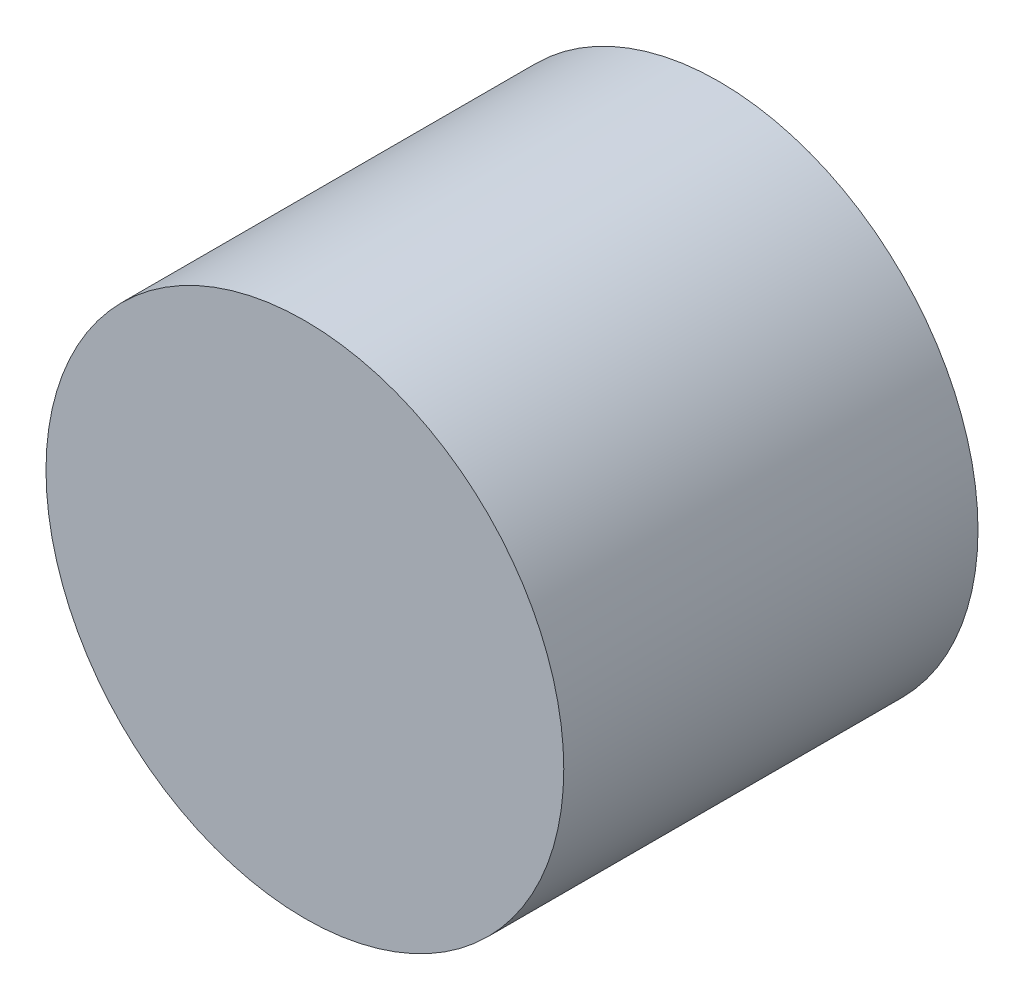
ISO-10303-21;
HEADER;
FILE_DESCRIPTION(('STEP AP214'),'2;1');
FILE_NAME('part.step','',(''),(''),'','','');
FILE_SCHEMA(('AUTOMOTIVE_DESIGN { 1 0 10303 214 1 1 1 1 }'));
ENDSEC;
DATA;
#1=APPLICATION_CONTEXT('core data for automotive mechanical design processes');
#2=APPLICATION_PROTOCOL_DEFINITION('international standard','automotive_design',2000,#1);
#3=PRODUCT_CONTEXT('',#1,'mechanical');
#4=PRODUCT('Part','Part','',(#3));
#5=PRODUCT_RELATED_PRODUCT_CATEGORY('part','',(#4));
#6=PRODUCT_DEFINITION_FORMATION('','',#4);
#7=PRODUCT_DEFINITION_CONTEXT('part definition',#1,'design');
#8=PRODUCT_DEFINITION('design','',#6,#7);
#9=PRODUCT_DEFINITION_SHAPE('','',#8);
#10=(LENGTH_UNIT() NAMED_UNIT(*) SI_UNIT(.MILLI.,.METRE.));
#11=(NAMED_UNIT(*) PLANE_ANGLE_UNIT() SI_UNIT($,.RADIAN.));
#12=(NAMED_UNIT(*) SI_UNIT($,.STERADIAN.) SOLID_ANGLE_UNIT());
#13=UNCERTAINTY_MEASURE_WITH_UNIT(LENGTH_MEASURE(1.E-05),#10,'distance_accuracy_value','');
#14=(GEOMETRIC_REPRESENTATION_CONTEXT(3) GLOBAL_UNCERTAINTY_ASSIGNED_CONTEXT((#13)) GLOBAL_UNIT_ASSIGNED_CONTEXT((#10,
#11,#12)) REPRESENTATION_CONTEXT('',''));
#15=CARTESIAN_POINT('',(0.,0.,0.));
#16=DIRECTION('',(0.,0.,1.));
#17=DIRECTION('',(1.,0.,0.));
#18=AXIS2_PLACEMENT_3D('',#15,#16,#17);
#19=CARTESIAN_POINT('',(0.,0.,25.4));
#20=DIRECTION('',(0.,0.,-1.));
#21=DIRECTION('',(-1.,0.,0.));
#22=AXIS2_PLACEMENT_3D('',#19,#20,#21);
#23=CYLINDRICAL_SURFACE('',#22,15.875);
#24=CARTESIAN_POINT('',(0.,0.,25.4));
#25=DIRECTION('',(0.,0.,1.));
#26=DIRECTION('',(1.,0.,0.));
#27=AXIS2_PLACEMENT_3D('',#24,#25,#26);
#28=CIRCLE('',#27,15.875);
#29=CARTESIAN_POINT('',(15.875,0.,25.4));
#30=VERTEX_POINT('',#29);
#31=EDGE_CURVE('E10',#30,#30,#28,.T.);
#32=ORIENTED_EDGE('',*,*,#31,.F.);
#33=EDGE_LOOP('',(#32));
#34=FACE_BOUND('',#33,.T.);
#35=CARTESIAN_POINT('',(0.,0.,0.));
#36=DIRECTION('',(0.,0.,1.));
#37=DIRECTION('',(1.,0.,0.));
#38=AXIS2_PLACEMENT_3D('',#35,#36,#37);
#39=CIRCLE('',#38,15.875);
#40=CARTESIAN_POINT('',(15.875,0.,0.));
#41=VERTEX_POINT('',#40);
#42=EDGE_CURVE('E35',#41,#41,#39,.T.);
#43=ORIENTED_EDGE('',*,*,#42,.T.);
#44=EDGE_LOOP('',(#43));
#45=FACE_BOUND('',#44,.T.);
#46=ADVANCED_FACE('F32',(#34,#45),#23,.T.);
#47=CARTESIAN_POINT('',(0.,0.,25.4));
#48=DIRECTION('',(0.,0.,1.));
#49=DIRECTION('',(1.,0.,0.));
#50=AXIS2_PLACEMENT_3D('',#47,#48,#49);
#51=PLANE('',#50);
#52=ORIENTED_EDGE('',*,*,#31,.T.);
#53=EDGE_LOOP('',(#52));
#54=FACE_BOUND('',#53,.T.);
#55=ADVANCED_FACE('F47',(#54),#51,.T.);
#56=CARTESIAN_POINT('',(0.,0.,0.));
#57=DIRECTION('',(0.,0.,1.));
#58=DIRECTION('',(1.,0.,0.));
#59=AXIS2_PLACEMENT_3D('',#56,#57,#58);
#60=PLANE('',#59);
#61=ORIENTED_EDGE('',*,*,#42,.F.);
#62=EDGE_LOOP('',(#61));
#63=FACE_BOUND('',#62,.T.);
#64=ADVANCED_FACE('F45',(#63),#60,.F.);
#65=CLOSED_SHELL('',(#46,#55,#64));
#66=MANIFOLD_SOLID_BREP('B2',#65);
#67=ADVANCED_BREP_SHAPE_REPRESENTATION('',(#18,#66),#14);
#68=SHAPE_DEFINITION_REPRESENTATION(#9,#67);
ENDSEC;
END-ISO-10303-21;
